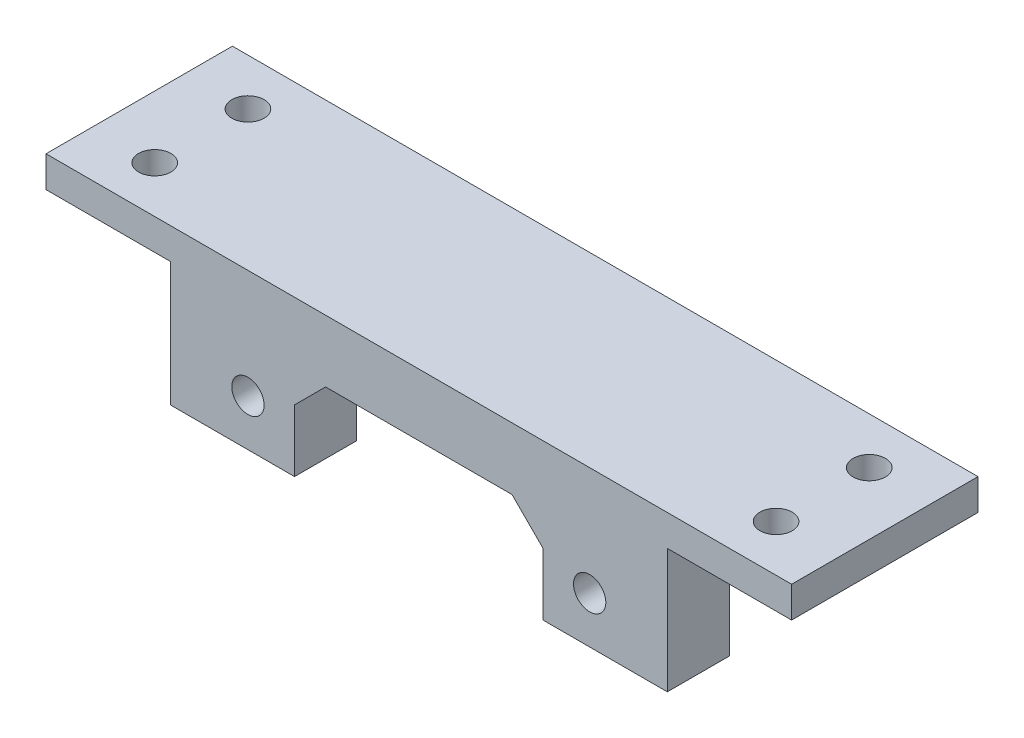
ISO-10303-21;
HEADER;
FILE_DESCRIPTION(('STEP AP214'),'2;1');
FILE_NAME('part.step','',(''),(''),'','','');
FILE_SCHEMA(('AUTOMOTIVE_DESIGN { 1 0 10303 214 1 1 1 1 }'));
ENDSEC;
DATA;
#1=APPLICATION_CONTEXT('core data for automotive mechanical design processes');
#2=APPLICATION_PROTOCOL_DEFINITION('international standard','automotive_design',2000,#1);
#3=PRODUCT_CONTEXT('',#1,'mechanical');
#4=PRODUCT('Part','Part','',(#3));
#5=PRODUCT_RELATED_PRODUCT_CATEGORY('part','',(#4));
#6=PRODUCT_DEFINITION_FORMATION('','',#4);
#7=PRODUCT_DEFINITION_CONTEXT('part definition',#1,'design');
#8=PRODUCT_DEFINITION('design','',#6,#7);
#9=PRODUCT_DEFINITION_SHAPE('','',#8);
#10=(LENGTH_UNIT() NAMED_UNIT(*) SI_UNIT(.MILLI.,.METRE.));
#11=(NAMED_UNIT(*) PLANE_ANGLE_UNIT() SI_UNIT($,.RADIAN.));
#12=(NAMED_UNIT(*) SI_UNIT($,.STERADIAN.) SOLID_ANGLE_UNIT());
#13=UNCERTAINTY_MEASURE_WITH_UNIT(LENGTH_MEASURE(1.E-05),#10,'distance_accuracy_value','');
#14=(GEOMETRIC_REPRESENTATION_CONTEXT(3) GLOBAL_UNCERTAINTY_ASSIGNED_CONTEXT((#13)) GLOBAL_UNIT_ASSIGNED_CONTEXT((#10,
#11,#12)) REPRESENTATION_CONTEXT('',''));
#15=CARTESIAN_POINT('',(0.,0.,0.));
#16=DIRECTION('',(0.,0.,1.));
#17=DIRECTION('',(1.,0.,0.));
#18=AXIS2_PLACEMENT_3D('',#15,#16,#17);
#19=CARTESIAN_POINT('',(0.,-20.,30.));
#20=DIRECTION('',(0.,1.,0.));
#21=DIRECTION('',(0.,0.,1.));
#22=AXIS2_PLACEMENT_3D('',#19,#20,#21);
#23=PLANE('',#22);
#24=DIRECTION('',(0.,0.,-1.));
#25=VECTOR('',#24,1.);
#26=CARTESIAN_POINT('',(40.,-20.,30.));
#27=LINE('',#26,#25);
#28=CARTESIAN_POINT('',(40.,-20.,10.));
#29=VERTEX_POINT('',#28);
#30=CARTESIAN_POINT('',(40.,-20.,0.));
#31=VERTEX_POINT('',#30);
#32=EDGE_CURVE('E413',#29,#31,#27,.T.);
#33=ORIENTED_EDGE('',*,*,#32,.F.);
#34=DIRECTION('',(-1.,0.,0.));
#35=VECTOR('',#34,1.);
#36=CARTESIAN_POINT('',(120.,-19.9999999999999,10.));
#37=LINE('',#36,#35);
#38=CARTESIAN_POINT('',(20.,-20.,10.));
#39=VERTEX_POINT('',#38);
#40=EDGE_CURVE('E300',#29,#39,#37,.T.);
#41=ORIENTED_EDGE('',*,*,#40,.T.);
#42=DIRECTION('',(0.,0.,-1.));
#43=VECTOR('',#42,1.);
#44=CARTESIAN_POINT('',(20.,-20.,30.));
#45=LINE('',#44,#43);
#46=CARTESIAN_POINT('',(20.,-20.,0.));
#47=VERTEX_POINT('',#46);
#48=EDGE_CURVE('E226',#39,#47,#45,.T.);
#49=ORIENTED_EDGE('',*,*,#48,.T.);
#50=DIRECTION('',(1.,0.,0.));
#51=VECTOR('',#50,1.);
#52=CARTESIAN_POINT('',(0.,-20.,0.));
#53=LINE('',#52,#51);
#54=EDGE_CURVE('E394',#47,#31,#53,.T.);
#55=ORIENTED_EDGE('',*,*,#54,.T.);
#56=EDGE_LOOP('',(#33,#41,#49,#55));
#57=FACE_BOUND('',#56,.T.);
#58=ADVANCED_FACE('F36',(#57),#23,.F.);
#59=CARTESIAN_POINT('',(40.,0.,30.));
#60=DIRECTION('',(-1.,0.,0.));
#61=DIRECTION('',(0.,0.,1.));
#62=AXIS2_PLACEMENT_3D('',#59,#60,#61);
#63=PLANE('',#62);
#64=DIRECTION('',(0.,0.,1.));
#65=VECTOR('',#64,1.);
#66=CARTESIAN_POINT('',(40.,-9.99999999999996,30.));
#67=LINE('',#66,#65);
#68=CARTESIAN_POINT('',(40.,-9.99999999999996,0.));
#69=VERTEX_POINT('',#68);
#70=CARTESIAN_POINT('',(40.,-9.99999999999996,9.99999999999999));
#71=VERTEX_POINT('',#70);
#72=EDGE_CURVE('E259',#69,#71,#67,.T.);
#73=ORIENTED_EDGE('',*,*,#72,.T.);
#74=DIRECTION('',(0.,-1.,0.));
#75=VECTOR('',#74,1.);
#76=CARTESIAN_POINT('',(40.,0.,9.99999999999999));
#77=LINE('',#76,#75);
#78=EDGE_CURVE('E319',#71,#29,#77,.T.);
#79=ORIENTED_EDGE('',*,*,#78,.T.);
#80=ORIENTED_EDGE('',*,*,#32,.T.);
#81=DIRECTION('',(0.,1.,0.));
#82=VECTOR('',#81,1.);
#83=CARTESIAN_POINT('',(40.,0.,0.));
#84=LINE('',#83,#82);
#85=EDGE_CURVE('E397',#31,#69,#84,.T.);
#86=ORIENTED_EDGE('',*,*,#85,.T.);
#87=EDGE_LOOP('',(#73,#79,#80,#86));
#88=FACE_BOUND('',#87,.T.);
#89=ADVANCED_FACE('F455',(#88),#63,.F.);
#90=CARTESIAN_POINT('',(80.,0.,30.));
#91=DIRECTION('',(1.,0.,0.));
#92=DIRECTION('',(0.,0.,-1.));
#93=AXIS2_PLACEMENT_3D('',#90,#91,#92);
#94=PLANE('',#93);
#95=DIRECTION('',(0.,0.,-1.));
#96=VECTOR('',#95,1.);
#97=CARTESIAN_POINT('',(80.,-20.,30.));
#98=LINE('',#97,#96);
#99=CARTESIAN_POINT('',(80.,-19.9999999999999,10.));
#100=VERTEX_POINT('',#99);
#101=CARTESIAN_POINT('',(80.,-20.,0.));
#102=VERTEX_POINT('',#101);
#103=EDGE_CURVE('E410',#100,#102,#98,.T.);
#104=ORIENTED_EDGE('',*,*,#103,.F.);
#105=DIRECTION('',(0.,1.,0.));
#106=VECTOR('',#105,1.);
#107=CARTESIAN_POINT('',(80.,0.,9.99999999999999));
#108=LINE('',#107,#106);
#109=CARTESIAN_POINT('',(80.,-10.,9.99999999999999));
#110=VERTEX_POINT('',#109);
#111=EDGE_CURVE('E325',#100,#110,#108,.T.);
#112=ORIENTED_EDGE('',*,*,#111,.T.);
#113=DIRECTION('',(0.,0.,-1.));
#114=VECTOR('',#113,1.);
#115=CARTESIAN_POINT('',(80.,-10.,0.));
#116=LINE('',#115,#114);
#117=CARTESIAN_POINT('',(80.,-10.,0.));
#118=VERTEX_POINT('',#117);
#119=EDGE_CURVE('E246',#110,#118,#116,.T.);
#120=ORIENTED_EDGE('',*,*,#119,.T.);
#121=DIRECTION('',(0.,-1.,0.));
#122=VECTOR('',#121,1.);
#123=CARTESIAN_POINT('',(80.,0.,0.));
#124=LINE('',#123,#122);
#125=EDGE_CURVE('E403',#118,#102,#124,.T.);
#126=ORIENTED_EDGE('',*,*,#125,.T.);
#127=EDGE_LOOP('',(#104,#112,#120,#126));
#128=FACE_BOUND('',#127,.T.);
#129=ADVANCED_FACE('F427',(#128),#94,.F.);
#130=CARTESIAN_POINT('',(0.,-20.,30.));
#131=DIRECTION('',(0.,1.,0.));
#132=DIRECTION('',(0.,0.,1.));
#133=AXIS2_PLACEMENT_3D('',#130,#131,#132);
#134=PLANE('',#133);
#135=DIRECTION('',(0.,0.,-1.));
#136=VECTOR('',#135,1.);
#137=CARTESIAN_POINT('',(100.,-20.,30.));
#138=LINE('',#137,#136);
#139=CARTESIAN_POINT('',(100.,-19.9999999999999,10.));
#140=VERTEX_POINT('',#139);
#141=CARTESIAN_POINT('',(100.,-20.,0.));
#142=VERTEX_POINT('',#141);
#143=EDGE_CURVE('E375',#140,#142,#138,.T.);
#144=ORIENTED_EDGE('',*,*,#143,.F.);
#145=EDGE_CURVE('E303',#140,#100,#37,.T.);
#146=ORIENTED_EDGE('',*,*,#145,.T.);
#147=ORIENTED_EDGE('',*,*,#103,.T.);
#148=DIRECTION('',(1.,0.,0.));
#149=VECTOR('',#148,1.);
#150=CARTESIAN_POINT('',(0.,-20.,0.));
#151=LINE('',#150,#149);
#152=EDGE_CURVE('E350',#102,#142,#151,.T.);
#153=ORIENTED_EDGE('',*,*,#152,.T.);
#154=EDGE_LOOP('',(#144,#146,#147,#153));
#155=FACE_BOUND('',#154,.T.);
#156=ADVANCED_FACE('F422',(#155),#134,.F.);
#157=CARTESIAN_POINT('',(80.,-10.,30.));
#158=DIRECTION('',(-0.707106781186552,-0.707106781186544,0.));
#159=DIRECTION('',(0.,0.,1.));
#160=AXIS2_PLACEMENT_3D('',#157,#158,#159);
#161=PLANE('',#160);
#162=ORIENTED_EDGE('',*,*,#119,.F.);
#163=DIRECTION('',(0.707106781186544,-0.707106781186552,0.));
#164=VECTOR('',#163,1.);
#165=CARTESIAN_POINT('',(80.,-10.,9.99999999999999));
#166=LINE('',#165,#164);
#167=CARTESIAN_POINT('',(75.,-4.99999999999995,10.));
#168=VERTEX_POINT('',#167);
#169=EDGE_CURVE('E322',#110,#168,#166,.F.);
#170=ORIENTED_EDGE('',*,*,#169,.T.);
#171=DIRECTION('',(0.,0.,1.));
#172=VECTOR('',#171,1.);
#173=CARTESIAN_POINT('',(75.,-5.,30.));
#174=LINE('',#173,#172);
#175=CARTESIAN_POINT('',(75.,-5.,0.));
#176=VERTEX_POINT('',#175);
#177=EDGE_CURVE('E255',#176,#168,#174,.T.);
#178=ORIENTED_EDGE('',*,*,#177,.F.);
#179=DIRECTION('',(0.707106781186544,-0.707106781186552,0.));
#180=VECTOR('',#179,1.);
#181=CARTESIAN_POINT('',(35.0000000000004,35.,0.));
#182=LINE('',#181,#180);
#183=EDGE_CURVE('E262',#118,#176,#182,.F.);
#184=ORIENTED_EDGE('',*,*,#183,.F.);
#185=EDGE_LOOP('',(#162,#170,#178,#184));
#186=FACE_BOUND('',#185,.T.);
#187=ADVANCED_FACE('F447',(#186),#161,.T.);
#188=CARTESIAN_POINT('',(45.0000000000001,-5.,30.));
#189=DIRECTION('',(0.707106781186543,-0.707106781186552,0.));
#190=DIRECTION('',(0.,0.,1.));
#191=AXIS2_PLACEMENT_3D('',#188,#189,#190);
#192=PLANE('',#191);
#193=DIRECTION('',(0.,0.,-1.));
#194=VECTOR('',#193,1.);
#195=CARTESIAN_POINT('',(45.0000000000001,-5.,0.));
#196=LINE('',#195,#194);
#197=CARTESIAN_POINT('',(45.0000000000001,-4.99999999999998,10.));
#198=VERTEX_POINT('',#197);
#199=CARTESIAN_POINT('',(45.0000000000001,-5.,0.));
#200=VERTEX_POINT('',#199);
#201=EDGE_CURVE('E250',#198,#200,#196,.T.);
#202=ORIENTED_EDGE('',*,*,#201,.F.);
#203=DIRECTION('',(0.707106781186552,0.707106781186543,0.));
#204=VECTOR('',#203,1.);
#205=CARTESIAN_POINT('',(45.0000000000001,-5.,9.99999999999999));
#206=LINE('',#205,#204);
#207=EDGE_CURVE('E11',#198,#71,#206,.F.);
#208=ORIENTED_EDGE('',*,*,#207,.T.);
#209=ORIENTED_EDGE('',*,*,#72,.F.);
#210=DIRECTION('',(0.707106781186552,0.707106781186543,0.));
#211=VECTOR('',#210,1.);
#212=CARTESIAN_POINT('',(24.9999999999997,-25.0000000000001,0.));
#213=LINE('',#212,#211);
#214=EDGE_CURVE('E266',#200,#69,#213,.F.);
#215=ORIENTED_EDGE('',*,*,#214,.F.);
#216=EDGE_LOOP('',(#202,#208,#209,#215));
#217=FACE_BOUND('',#216,.T.);
#218=ADVANCED_FACE('F457',(#217),#192,.T.);
#219=CARTESIAN_POINT('',(100.,0.,30.));
#220=DIRECTION('',(-1.,0.,0.));
#221=DIRECTION('',(0.,0.,1.));
#222=AXIS2_PLACEMENT_3D('',#219,#220,#221);
#223=PLANE('',#222);
#224=DIRECTION('',(0.,0.,-1.));
#225=VECTOR('',#224,1.);
#226=CARTESIAN_POINT('',(100.,-4.99999999999993,30.));
#227=LINE('',#226,#225);
#228=CARTESIAN_POINT('',(100.,-4.99999999999993,20.));
#229=VERTEX_POINT('',#228);
#230=CARTESIAN_POINT('',(100.,-4.99999999999993,10.));
#231=VERTEX_POINT('',#230);
#232=EDGE_CURVE('E316',#229,#231,#227,.T.);
#233=ORIENTED_EDGE('',*,*,#232,.T.);
#234=DIRECTION('',(0.,-1.,0.));
#235=VECTOR('',#234,1.);
#236=CARTESIAN_POINT('',(100.,0.,9.99999999999999));
#237=LINE('',#236,#235);
#238=EDGE_CURVE('E328',#231,#140,#237,.T.);
#239=ORIENTED_EDGE('',*,*,#238,.T.);
#240=ORIENTED_EDGE('',*,*,#143,.T.);
#241=DIRECTION('',(0.,1.,0.));
#242=VECTOR('',#241,1.);
#243=CARTESIAN_POINT('',(100.,0.,0.));
#244=LINE('',#243,#242);
#245=CARTESIAN_POINT('',(100.,0.,0.));
#246=VERTEX_POINT('',#245);
#247=EDGE_CURVE('E273',#142,#246,#244,.T.);
#248=ORIENTED_EDGE('',*,*,#247,.T.);
#249=DIRECTION('',(0.,0.,-1.));
#250=VECTOR('',#249,1.);
#251=CARTESIAN_POINT('',(100.,0.,30.));
#252=LINE('',#251,#250);
#253=CARTESIAN_POINT('',(100.,0.,30.));
#254=VERTEX_POINT('',#253);
#255=EDGE_CURVE('E243',#254,#246,#252,.T.);
#256=ORIENTED_EDGE('',*,*,#255,.F.);
#257=DIRECTION('',(0.,1.,0.));
#258=VECTOR('',#257,1.);
#259=CARTESIAN_POINT('',(100.,0.,30.));
#260=LINE('',#259,#258);
#261=CARTESIAN_POINT('',(100.,-20.,30.));
#262=VERTEX_POINT('',#261);
#263=EDGE_CURVE('E346',#262,#254,#260,.T.);
#264=ORIENTED_EDGE('',*,*,#263,.F.);
#265=CARTESIAN_POINT('',(100.,-19.9999999999999,20.));
#266=VERTEX_POINT('',#265);
#267=EDGE_CURVE('E408',#262,#266,#138,.T.);
#268=ORIENTED_EDGE('',*,*,#267,.T.);
#269=DIRECTION('',(0.,1.,0.));
#270=VECTOR('',#269,1.);
#271=CARTESIAN_POINT('',(100.,0.,20.));
#272=LINE('',#271,#270);
#273=EDGE_CURVE('E313',#266,#229,#272,.T.);
#274=ORIENTED_EDGE('',*,*,#273,.T.);
#275=EDGE_LOOP('',(#233,#239,#240,#248,#256,#264,#268,#274));
#276=FACE_BOUND('',#275,.T.);
#277=ADVANCED_FACE('F435',(#276),#223,.F.);
#278=CARTESIAN_POINT('',(0.,0.,30.));
#279=DIRECTION('',(0.,1.,0.));
#280=DIRECTION('',(0.,0.,1.));
#281=AXIS2_PLACEMENT_3D('',#278,#279,#280);
#282=PLANE('',#281);
#283=CARTESIAN_POINT('',(110.,0.,7.5));
#284=DIRECTION('',(0.,1.,0.));
#285=DIRECTION('',(0.,0.,1.));
#286=AXIS2_PLACEMENT_3D('',#283,#284,#285);
#287=CIRCLE('',#286,2.6);
#288=CARTESIAN_POINT('',(110.,0.,10.1));
#289=VERTEX_POINT('',#288);
#290=EDGE_CURVE('E341',#289,#289,#287,.T.);
#291=ORIENTED_EDGE('',*,*,#290,.T.);
#292=EDGE_LOOP('',(#291));
#293=FACE_BOUND('',#292,.T.);
#294=CARTESIAN_POINT('',(110.,0.,22.5));
#295=DIRECTION('',(0.,1.,0.));
#296=DIRECTION('',(0.,0.,1.));
#297=AXIS2_PLACEMENT_3D('',#294,#295,#296);
#298=CIRCLE('',#297,2.6);
#299=CARTESIAN_POINT('',(110.,0.,25.1));
#300=VERTEX_POINT('',#299);
#301=EDGE_CURVE('E278',#300,#300,#298,.T.);
#302=ORIENTED_EDGE('',*,*,#301,.T.);
#303=EDGE_LOOP('',(#302));
#304=FACE_BOUND('',#303,.T.);
#305=DIRECTION('',(1.,0.,0.));
#306=VECTOR('',#305,1.);
#307=CARTESIAN_POINT('',(0.,0.,0.));
#308=LINE('',#307,#306);
#309=CARTESIAN_POINT('',(120.,0.,0.));
#310=VERTEX_POINT('',#309);
#311=EDGE_CURVE('E378',#246,#310,#308,.T.);
#312=ORIENTED_EDGE('',*,*,#311,.T.);
#313=DIRECTION('',(0.,0.,-1.));
#314=VECTOR('',#313,1.);
#315=CARTESIAN_POINT('',(120.,0.,30.));
#316=LINE('',#315,#314);
#317=CARTESIAN_POINT('',(120.,0.,30.));
#318=VERTEX_POINT('',#317);
#319=EDGE_CURVE('E240',#318,#310,#316,.T.);
#320=ORIENTED_EDGE('',*,*,#319,.F.);
#321=DIRECTION('',(1.,0.,0.));
#322=VECTOR('',#321,1.);
#323=CARTESIAN_POINT('',(0.,0.,30.));
#324=LINE('',#323,#322);
#325=EDGE_CURVE('E349',#254,#318,#324,.T.);
#326=ORIENTED_EDGE('',*,*,#325,.F.);
#327=ORIENTED_EDGE('',*,*,#255,.T.);
#328=EDGE_LOOP('',(#312,#320,#326,#327));
#329=FACE_BOUND('',#328,.T.);
#330=ADVANCED_FACE('F482',(#293,#304,#329),#282,.F.);
#331=CARTESIAN_POINT('',(120.,0.,30.));
#332=DIRECTION('',(-1.,0.,0.));
#333=DIRECTION('',(0.,0.,1.));
#334=AXIS2_PLACEMENT_3D('',#331,#332,#333);
#335=PLANE('',#334);
#336=DIRECTION('',(0.,1.,0.));
#337=VECTOR('',#336,1.);
#338=CARTESIAN_POINT('',(120.,0.,0.));
#339=LINE('',#338,#337);
#340=CARTESIAN_POINT('',(120.,5.,0.));
#341=VERTEX_POINT('',#340);
#342=EDGE_CURVE('E380',#310,#341,#339,.T.);
#343=ORIENTED_EDGE('',*,*,#342,.T.);
#344=DIRECTION('',(0.,0.,-1.));
#345=VECTOR('',#344,1.);
#346=CARTESIAN_POINT('',(120.,5.,30.));
#347=LINE('',#346,#345);
#348=CARTESIAN_POINT('',(120.,5.,30.));
#349=VERTEX_POINT('',#348);
#350=EDGE_CURVE('E238',#349,#341,#347,.T.);
#351=ORIENTED_EDGE('',*,*,#350,.F.);
#352=DIRECTION('',(0.,1.,0.));
#353=VECTOR('',#352,1.);
#354=CARTESIAN_POINT('',(120.,0.,30.));
#355=LINE('',#354,#353);
#356=EDGE_CURVE('E352',#318,#349,#355,.T.);
#357=ORIENTED_EDGE('',*,*,#356,.F.);
#358=ORIENTED_EDGE('',*,*,#319,.T.);
#359=EDGE_LOOP('',(#343,#351,#357,#358));
#360=FACE_BOUND('',#359,.T.);
#361=ADVANCED_FACE('F479',(#360),#335,.F.);
#362=CARTESIAN_POINT('',(0.,5.,30.));
#363=DIRECTION('',(0.,1.,0.));
#364=DIRECTION('',(0.,0.,1.));
#365=AXIS2_PLACEMENT_3D('',#362,#363,#364);
#366=PLANE('',#365);
#367=CARTESIAN_POINT('',(10.,5.,22.5));
#368=DIRECTION('',(0.,1.,0.));
#369=DIRECTION('',(0.,0.,1.));
#370=AXIS2_PLACEMENT_3D('',#367,#368,#369);
#371=CIRCLE('',#370,2.6);
#372=CARTESIAN_POINT('',(10.,5.,25.1));
#373=VERTEX_POINT('',#372);
#374=EDGE_CURVE('E279',#373,#373,#371,.T.);
#375=ORIENTED_EDGE('',*,*,#374,.F.);
#376=EDGE_LOOP('',(#375));
#377=FACE_BOUND('',#376,.T.);
#378=CARTESIAN_POINT('',(110.,5.,7.5));
#379=DIRECTION('',(0.,1.,0.));
#380=DIRECTION('',(0.,0.,1.));
#381=AXIS2_PLACEMENT_3D('',#378,#379,#380);
#382=CIRCLE('',#381,2.6);
#383=CARTESIAN_POINT('',(110.,5.,10.1));
#384=VERTEX_POINT('',#383);
#385=EDGE_CURVE('E334',#384,#384,#382,.T.);
#386=ORIENTED_EDGE('',*,*,#385,.F.);
#387=EDGE_LOOP('',(#386));
#388=FACE_BOUND('',#387,.T.);
#389=CARTESIAN_POINT('',(110.,5.,22.5));
#390=DIRECTION('',(0.,1.,0.));
#391=DIRECTION('',(0.,0.,1.));
#392=AXIS2_PLACEMENT_3D('',#389,#390,#391);
#393=CIRCLE('',#392,2.6);
#394=CARTESIAN_POINT('',(110.,5.,25.1));
#395=VERTEX_POINT('',#394);
#396=EDGE_CURVE('E331',#395,#395,#393,.T.);
#397=ORIENTED_EDGE('',*,*,#396,.F.);
#398=EDGE_LOOP('',(#397));
#399=FACE_BOUND('',#398,.T.);
#400=CARTESIAN_POINT('',(10.,5.,7.5));
#401=DIRECTION('',(0.,1.,0.));
#402=DIRECTION('',(0.,0.,1.));
#403=AXIS2_PLACEMENT_3D('',#400,#401,#402);
#404=CIRCLE('',#403,2.6);
#405=CARTESIAN_POINT('',(10.,5.,10.1));
#406=VERTEX_POINT('',#405);
#407=EDGE_CURVE('E274',#406,#406,#404,.T.);
#408=ORIENTED_EDGE('',*,*,#407,.F.);
#409=EDGE_LOOP('',(#408));
#410=FACE_BOUND('',#409,.T.);
#411=DIRECTION('',(1.,0.,0.));
#412=VECTOR('',#411,1.);
#413=CARTESIAN_POINT('',(0.,5.,0.));
#414=LINE('',#413,#412);
#415=CARTESIAN_POINT('',(0.,5.,0.));
#416=VERTEX_POINT('',#415);
#417=EDGE_CURVE('E383',#416,#341,#414,.T.);
#418=ORIENTED_EDGE('',*,*,#417,.F.);
#419=DIRECTION('',(0.,0.,-1.));
#420=VECTOR('',#419,1.);
#421=CARTESIAN_POINT('',(0.,5.,30.));
#422=LINE('',#421,#420);
#423=CARTESIAN_POINT('',(0.,5.,30.));
#424=VERTEX_POINT('',#423);
#425=EDGE_CURVE('E236',#424,#416,#422,.T.);
#426=ORIENTED_EDGE('',*,*,#425,.F.);
#427=DIRECTION('',(1.,0.,0.));
#428=VECTOR('',#427,1.);
#429=CARTESIAN_POINT('',(0.,5.,30.));
#430=LINE('',#429,#428);
#431=EDGE_CURVE('E354',#424,#349,#430,.T.);
#432=ORIENTED_EDGE('',*,*,#431,.T.);
#433=ORIENTED_EDGE('',*,*,#350,.T.);
#434=EDGE_LOOP('',(#418,#426,#432,#433));
#435=FACE_BOUND('',#434,.T.);
#436=ADVANCED_FACE('F474',(#377,#388,#399,#410,#435),#366,.T.);
#437=CARTESIAN_POINT('',(0.,0.,30.));
#438=DIRECTION('',(-1.,0.,0.));
#439=DIRECTION('',(0.,0.,1.));
#440=AXIS2_PLACEMENT_3D('',#437,#438,#439);
#441=PLANE('',#440);
#442=DIRECTION('',(0.,1.,0.));
#443=VECTOR('',#442,1.);
#444=CARTESIAN_POINT('',(0.,0.,0.));
#445=LINE('',#444,#443);
#446=CARTESIAN_POINT('',(0.,0.,0.));
#447=VERTEX_POINT('',#446);
#448=EDGE_CURVE('E386',#447,#416,#445,.T.);
#449=ORIENTED_EDGE('',*,*,#448,.F.);
#450=DIRECTION('',(0.,0.,-1.));
#451=VECTOR('',#450,1.);
#452=CARTESIAN_POINT('',(0.,0.,30.));
#453=LINE('',#452,#451);
#454=CARTESIAN_POINT('',(0.,0.,30.));
#455=VERTEX_POINT('',#454);
#456=EDGE_CURVE('E229',#455,#447,#453,.T.);
#457=ORIENTED_EDGE('',*,*,#456,.F.);
#458=DIRECTION('',(0.,1.,0.));
#459=VECTOR('',#458,1.);
#460=CARTESIAN_POINT('',(0.,0.,30.));
#461=LINE('',#460,#459);
#462=EDGE_CURVE('E357',#455,#424,#461,.T.);
#463=ORIENTED_EDGE('',*,*,#462,.T.);
#464=ORIENTED_EDGE('',*,*,#425,.T.);
#465=EDGE_LOOP('',(#449,#457,#463,#464));
#466=FACE_BOUND('',#465,.T.);
#467=ADVANCED_FACE('F471',(#466),#441,.T.);
#468=CARTESIAN_POINT('',(0.,0.,30.));
#469=DIRECTION('',(0.,1.,0.));
#470=DIRECTION('',(0.,0.,1.));
#471=AXIS2_PLACEMENT_3D('',#468,#469,#470);
#472=PLANE('',#471);
#473=CARTESIAN_POINT('',(10.,0.,22.5));
#474=DIRECTION('',(0.,1.,0.));
#475=DIRECTION('',(0.,0.,1.));
#476=AXIS2_PLACEMENT_3D('',#473,#474,#475);
#477=CIRCLE('',#476,2.6);
#478=CARTESIAN_POINT('',(10.,0.,25.1));
#479=VERTEX_POINT('',#478);
#480=EDGE_CURVE('E275',#479,#479,#477,.T.);
#481=ORIENTED_EDGE('',*,*,#480,.T.);
#482=EDGE_LOOP('',(#481));
#483=FACE_BOUND('',#482,.T.);
#484=CARTESIAN_POINT('',(10.,0.,7.5));
#485=DIRECTION('',(0.,1.,0.));
#486=DIRECTION('',(0.,0.,1.));
#487=AXIS2_PLACEMENT_3D('',#484,#485,#486);
#488=CIRCLE('',#487,2.6);
#489=CARTESIAN_POINT('',(10.,0.,10.1));
#490=VERTEX_POINT('',#489);
#491=EDGE_CURVE('E270',#490,#490,#488,.T.);
#492=ORIENTED_EDGE('',*,*,#491,.T.);
#493=EDGE_LOOP('',(#492));
#494=FACE_BOUND('',#493,.T.);
#495=DIRECTION('',(1.,0.,0.));
#496=VECTOR('',#495,1.);
#497=CARTESIAN_POINT('',(0.,0.,0.));
#498=LINE('',#497,#496);
#499=CARTESIAN_POINT('',(20.,0.,0.));
#500=VERTEX_POINT('',#499);
#501=EDGE_CURVE('E389',#447,#500,#498,.T.);
#502=ORIENTED_EDGE('',*,*,#501,.T.);
#503=DIRECTION('',(0.,0.,-1.));
#504=VECTOR('',#503,1.);
#505=CARTESIAN_POINT('',(20.,0.,30.));
#506=LINE('',#505,#504);
#507=CARTESIAN_POINT('',(20.,0.,30.));
#508=VERTEX_POINT('',#507);
#509=EDGE_CURVE('E225',#508,#500,#506,.T.);
#510=ORIENTED_EDGE('',*,*,#509,.F.);
#511=DIRECTION('',(1.,0.,0.));
#512=VECTOR('',#511,1.);
#513=CARTESIAN_POINT('',(0.,0.,30.));
#514=LINE('',#513,#512);
#515=EDGE_CURVE('E360',#455,#508,#514,.T.);
#516=ORIENTED_EDGE('',*,*,#515,.F.);
#517=ORIENTED_EDGE('',*,*,#456,.T.);
#518=EDGE_LOOP('',(#502,#510,#516,#517));
#519=FACE_BOUND('',#518,.T.);
#520=ADVANCED_FACE('F468',(#483,#494,#519),#472,.F.);
#521=CARTESIAN_POINT('',(20.,0.,30.));
#522=DIRECTION('',(1.,0.,0.));
#523=DIRECTION('',(0.,1.,0.));
#524=AXIS2_PLACEMENT_3D('',#521,#522,#523);
#525=PLANE('',#524);
#526=ORIENTED_EDGE('',*,*,#48,.F.);
#527=DIRECTION('',(0.,-1.,0.));
#528=VECTOR('',#527,1.);
#529=CARTESIAN_POINT('',(20.,-20.,10.));
#530=LINE('',#529,#528);
#531=CARTESIAN_POINT('',(20.,-5.,10.));
#532=VERTEX_POINT('',#531);
#533=EDGE_CURVE('E209',#532,#39,#530,.T.);
#534=ORIENTED_EDGE('',*,*,#533,.F.);
#535=DIRECTION('',(0.,0.,-1.));
#536=VECTOR('',#535,1.);
#537=CARTESIAN_POINT('',(20.,-5.,10.));
#538=LINE('',#537,#536);
#539=CARTESIAN_POINT('',(20.,-5.,20.));
#540=VERTEX_POINT('',#539);
#541=EDGE_CURVE('E220',#540,#532,#538,.T.);
#542=ORIENTED_EDGE('',*,*,#541,.F.);
#543=DIRECTION('',(0.,1.,0.));
#544=VECTOR('',#543,1.);
#545=CARTESIAN_POINT('',(20.,-5.,20.));
#546=LINE('',#545,#544);
#547=CARTESIAN_POINT('',(20.,-20.,20.));
#548=VERTEX_POINT('',#547);
#549=EDGE_CURVE('E200',#548,#540,#546,.T.);
#550=ORIENTED_EDGE('',*,*,#549,.F.);
#551=CARTESIAN_POINT('',(20.,-20.,30.));
#552=VERTEX_POINT('',#551);
#553=EDGE_CURVE('E216',#552,#548,#45,.T.);
#554=ORIENTED_EDGE('',*,*,#553,.F.);
#555=DIRECTION('',(0.,-1.,0.));
#556=VECTOR('',#555,1.);
#557=CARTESIAN_POINT('',(20.,0.,30.));
#558=LINE('',#557,#556);
#559=EDGE_CURVE('E362',#508,#552,#558,.T.);
#560=ORIENTED_EDGE('',*,*,#559,.F.);
#561=ORIENTED_EDGE('',*,*,#509,.T.);
#562=DIRECTION('',(0.,-1.,0.));
#563=VECTOR('',#562,1.);
#564=CARTESIAN_POINT('',(20.,0.,0.));
#565=LINE('',#564,#563);
#566=EDGE_CURVE('E391',#500,#47,#565,.T.);
#567=ORIENTED_EDGE('',*,*,#566,.T.);
#568=EDGE_LOOP('',(#526,#534,#542,#550,#554,#560,#561,#567));
#569=FACE_BOUND('',#568,.T.);
#570=ADVANCED_FACE('F214',(#569),#525,.F.);
#571=ORIENTED_EDGE('',*,*,#553,.T.);
#572=DIRECTION('',(-1.,0.,0.));
#573=VECTOR('',#572,1.);
#574=CARTESIAN_POINT('',(120.,-19.9999999999999,20.));
#575=LINE('',#574,#573);
#576=CARTESIAN_POINT('',(40.,-20.,20.));
#577=VERTEX_POINT('',#576);
#578=EDGE_CURVE('E197',#577,#548,#575,.T.);
#579=ORIENTED_EDGE('',*,*,#578,.F.);
#580=CARTESIAN_POINT('',(40.,-20.,30.));
#581=VERTEX_POINT('',#580);
#582=EDGE_CURVE('E231',#581,#577,#27,.T.);
#583=ORIENTED_EDGE('',*,*,#582,.F.);
#584=DIRECTION('',(1.,0.,0.));
#585=VECTOR('',#584,1.);
#586=CARTESIAN_POINT('',(0.,-20.,30.));
#587=LINE('',#586,#585);
#588=EDGE_CURVE('E224',#552,#581,#587,.T.);
#589=ORIENTED_EDGE('',*,*,#588,.F.);
#590=EDGE_LOOP('',(#571,#579,#583,#589));
#591=FACE_BOUND('',#590,.T.);
#592=ADVANCED_FACE('F223',(#591),#23,.F.);
#593=ORIENTED_EDGE('',*,*,#582,.T.);
#594=DIRECTION('',(0.,1.,0.));
#595=VECTOR('',#594,1.);
#596=CARTESIAN_POINT('',(40.,0.,20.));
#597=LINE('',#596,#595);
#598=CARTESIAN_POINT('',(40.,-9.99999999999996,20.));
#599=VERTEX_POINT('',#598);
#600=EDGE_CURVE('E203',#577,#599,#597,.T.);
#601=ORIENTED_EDGE('',*,*,#600,.T.);
#602=CARTESIAN_POINT('',(40.,-9.99999999999996,30.));
#603=VERTEX_POINT('',#602);
#604=EDGE_CURVE('E258',#599,#603,#67,.T.);
#605=ORIENTED_EDGE('',*,*,#604,.T.);
#606=DIRECTION('',(0.,1.,0.));
#607=VECTOR('',#606,1.);
#608=CARTESIAN_POINT('',(40.,0.,30.));
#609=LINE('',#608,#607);
#610=EDGE_CURVE('E365',#581,#603,#609,.T.);
#611=ORIENTED_EDGE('',*,*,#610,.F.);
#612=EDGE_LOOP('',(#593,#601,#605,#611));
#613=FACE_BOUND('',#612,.T.);
#614=ADVANCED_FACE('F503',(#613),#63,.F.);
#615=CARTESIAN_POINT('',(0.,-5.,30.));
#616=DIRECTION('',(0.,1.,0.));
#617=DIRECTION('',(0.,0.,1.));
#618=AXIS2_PLACEMENT_3D('',#615,#616,#617);
#619=PLANE('',#618);
#620=CARTESIAN_POINT('',(45.0000000000001,-5.,30.));
#621=VERTEX_POINT('',#620);
#622=CARTESIAN_POINT('',(45.0000000000001,-5.,20.));
#623=VERTEX_POINT('',#622);
#624=EDGE_CURVE('E251',#621,#623,#196,.T.);
#625=ORIENTED_EDGE('',*,*,#624,.T.);
#626=DIRECTION('',(-1.,0.,0.));
#627=VECTOR('',#626,1.);
#628=CARTESIAN_POINT('',(120.,-4.99999999999991,20.));
#629=LINE('',#628,#627);
#630=EDGE_CURVE('E61',#623,#540,#629,.T.);
#631=ORIENTED_EDGE('',*,*,#630,.T.);
#632=ORIENTED_EDGE('',*,*,#541,.T.);
#633=DIRECTION('',(-1.,0.,0.));
#634=VECTOR('',#633,1.);
#635=CARTESIAN_POINT('',(120.,-4.99999999999991,10.));
#636=LINE('',#635,#634);
#637=EDGE_CURVE('E305',#198,#532,#636,.T.);
#638=ORIENTED_EDGE('',*,*,#637,.F.);
#639=ORIENTED_EDGE('',*,*,#201,.T.);
#640=DIRECTION('',(1.,0.,0.));
#641=VECTOR('',#640,1.);
#642=CARTESIAN_POINT('',(0.,-5.,0.));
#643=LINE('',#642,#641);
#644=EDGE_CURVE('E400',#200,#176,#643,.T.);
#645=ORIENTED_EDGE('',*,*,#644,.T.);
#646=ORIENTED_EDGE('',*,*,#177,.T.);
#647=EDGE_CURVE('E304',#231,#168,#636,.T.);
#648=ORIENTED_EDGE('',*,*,#647,.F.);
#649=ORIENTED_EDGE('',*,*,#232,.F.);
#650=CARTESIAN_POINT('',(75.,-4.99999999999996,20.));
#651=VERTEX_POINT('',#650);
#652=EDGE_CURVE('E307',#229,#651,#629,.T.);
#653=ORIENTED_EDGE('',*,*,#652,.T.);
#654=CARTESIAN_POINT('',(75.,-5.,30.));
#655=VERTEX_POINT('',#654);
#656=EDGE_CURVE('E254',#651,#655,#174,.T.);
#657=ORIENTED_EDGE('',*,*,#656,.T.);
#658=DIRECTION('',(1.,0.,0.));
#659=VECTOR('',#658,1.);
#660=CARTESIAN_POINT('',(0.,-5.,30.));
#661=LINE('',#660,#659);
#662=EDGE_CURVE('E368',#621,#655,#661,.T.);
#663=ORIENTED_EDGE('',*,*,#662,.F.);
#664=EDGE_LOOP('',(#625,#631,#632,#638,#639,#645,#646,#648,#649,#653,#657,#663));
#665=FACE_BOUND('',#664,.T.);
#666=ADVANCED_FACE('F441',(#665),#619,.F.);
#667=CARTESIAN_POINT('',(80.,-10.,30.));
#668=VERTEX_POINT('',#667);
#669=CARTESIAN_POINT('',(80.,-10.,20.));
#670=VERTEX_POINT('',#669);
#671=EDGE_CURVE('E247',#668,#670,#116,.T.);
#672=ORIENTED_EDGE('',*,*,#671,.T.);
#673=DIRECTION('',(0.,-1.,0.));
#674=VECTOR('',#673,1.);
#675=CARTESIAN_POINT('',(80.,0.,20.));
#676=LINE('',#675,#674);
#677=CARTESIAN_POINT('',(80.,-19.9999999999999,20.));
#678=VERTEX_POINT('',#677);
#679=EDGE_CURVE('E53',#670,#678,#676,.T.);
#680=ORIENTED_EDGE('',*,*,#679,.T.);
#681=CARTESIAN_POINT('',(80.,-20.,30.));
#682=VERTEX_POINT('',#681);
#683=EDGE_CURVE('E411',#682,#678,#98,.T.);
#684=ORIENTED_EDGE('',*,*,#683,.F.);
#685=DIRECTION('',(0.,-1.,0.));
#686=VECTOR('',#685,1.);
#687=CARTESIAN_POINT('',(80.,0.,30.));
#688=LINE('',#687,#686);
#689=EDGE_CURVE('E371',#668,#682,#688,.T.);
#690=ORIENTED_EDGE('',*,*,#689,.F.);
#691=EDGE_LOOP('',(#672,#680,#684,#690));
#692=FACE_BOUND('',#691,.T.);
#693=ADVANCED_FACE('F489',(#692),#94,.F.);
#694=ORIENTED_EDGE('',*,*,#683,.T.);
#695=EDGE_CURVE('E208',#266,#678,#575,.T.);
#696=ORIENTED_EDGE('',*,*,#695,.F.);
#697=ORIENTED_EDGE('',*,*,#267,.F.);
#698=DIRECTION('',(1.,0.,0.));
#699=VECTOR('',#698,1.);
#700=CARTESIAN_POINT('',(0.,-20.,30.));
#701=LINE('',#700,#699);
#702=EDGE_CURVE('E373',#682,#262,#701,.T.);
#703=ORIENTED_EDGE('',*,*,#702,.F.);
#704=EDGE_LOOP('',(#694,#696,#697,#703));
#705=FACE_BOUND('',#704,.T.);
#706=ADVANCED_FACE('F486',(#705),#134,.F.);
#707=CARTESIAN_POINT('',(0.,0.,30.));
#708=DIRECTION('',(0.,0.,1.));
#709=DIRECTION('',(1.,0.,0.));
#710=AXIS2_PLACEMENT_3D('',#707,#708,#709);
#711=PLANE('',#710);
#712=CARTESIAN_POINT('',(32.5,-12.5,30.));
#713=DIRECTION('',(0.,0.,-1.));
#714=DIRECTION('',(-1.,0.,0.));
#715=AXIS2_PLACEMENT_3D('',#712,#713,#714);
#716=CIRCLE('',#715,2.6);
#717=CARTESIAN_POINT('',(29.9,-12.5,30.));
#718=VERTEX_POINT('',#717);
#719=EDGE_CURVE('E787',#718,#718,#716,.T.);
#720=ORIENTED_EDGE('',*,*,#719,.T.);
#721=EDGE_LOOP('',(#720));
#722=FACE_BOUND('',#721,.T.);
#723=CARTESIAN_POINT('',(87.5,-12.5,30.));
#724=DIRECTION('',(0.,0.,-1.));
#725=DIRECTION('',(-1.,0.,0.));
#726=AXIS2_PLACEMENT_3D('',#723,#724,#725);
#727=CIRCLE('',#726,2.6);
#728=CARTESIAN_POINT('',(84.9,-12.5,30.));
#729=VERTEX_POINT('',#728);
#730=EDGE_CURVE('E282',#729,#729,#727,.T.);
#731=ORIENTED_EDGE('',*,*,#730,.T.);
#732=EDGE_LOOP('',(#731));
#733=FACE_BOUND('',#732,.T.);
#734=ORIENTED_EDGE('',*,*,#263,.T.);
#735=ORIENTED_EDGE('',*,*,#325,.T.);
#736=ORIENTED_EDGE('',*,*,#356,.T.);
#737=ORIENTED_EDGE('',*,*,#431,.F.);
#738=ORIENTED_EDGE('',*,*,#462,.F.);
#739=ORIENTED_EDGE('',*,*,#515,.T.);
#740=ORIENTED_EDGE('',*,*,#559,.T.);
#741=ORIENTED_EDGE('',*,*,#588,.T.);
#742=ORIENTED_EDGE('',*,*,#610,.T.);
#743=DIRECTION('',(-0.707106781186552,-0.707106781186543,0.));
#744=VECTOR('',#743,1.);
#745=CARTESIAN_POINT('',(45.0000000000001,-5.,30.));
#746=LINE('',#745,#744);
#747=EDGE_CURVE('E268',#603,#621,#746,.F.);
#748=ORIENTED_EDGE('',*,*,#747,.T.);
#749=ORIENTED_EDGE('',*,*,#662,.T.);
#750=DIRECTION('',(-0.707106781186544,0.707106781186552,0.));
#751=VECTOR('',#750,1.);
#752=CARTESIAN_POINT('',(80.,-10.,30.));
#753=LINE('',#752,#751);
#754=EDGE_CURVE('E264',#655,#668,#753,.F.);
#755=ORIENTED_EDGE('',*,*,#754,.T.);
#756=ORIENTED_EDGE('',*,*,#689,.T.);
#757=ORIENTED_EDGE('',*,*,#702,.T.);
#758=EDGE_LOOP('',(#734,#735,#736,#737,#738,#739,#740,#741,#742,#748,#749,#755,#756,#757));
#759=FACE_BOUND('',#758,.T.);
#760=ADVANCED_FACE('F484',(#722,#733,#759),#711,.T.);
#761=CARTESIAN_POINT('',(0.,0.,0.));
#762=DIRECTION('',(0.,0.,1.));
#763=DIRECTION('',(1.,0.,0.));
#764=AXIS2_PLACEMENT_3D('',#761,#762,#763);
#765=PLANE('',#764);
#766=CARTESIAN_POINT('',(32.5,-12.5,0.));
#767=DIRECTION('',(0.,0.,-1.));
#768=DIRECTION('',(-1.,0.,0.));
#769=AXIS2_PLACEMENT_3D('',#766,#767,#768);
#770=CIRCLE('',#769,2.6);
#771=CARTESIAN_POINT('',(29.9,-12.5,0.));
#772=VERTEX_POINT('',#771);
#773=EDGE_CURVE('E792',#772,#772,#770,.T.);
#774=ORIENTED_EDGE('',*,*,#773,.F.);
#775=EDGE_LOOP('',(#774));
#776=FACE_BOUND('',#775,.T.);
#777=CARTESIAN_POINT('',(87.5,-12.5,0.));
#778=DIRECTION('',(0.,0.,-1.));
#779=DIRECTION('',(-1.,0.,0.));
#780=AXIS2_PLACEMENT_3D('',#777,#778,#779);
#781=CIRCLE('',#780,2.6);
#782=CARTESIAN_POINT('',(84.9,-12.5,0.));
#783=VERTEX_POINT('',#782);
#784=EDGE_CURVE('E288',#783,#783,#781,.T.);
#785=ORIENTED_EDGE('',*,*,#784,.F.);
#786=EDGE_LOOP('',(#785));
#787=FACE_BOUND('',#786,.T.);
#788=ORIENTED_EDGE('',*,*,#247,.F.);
#789=ORIENTED_EDGE('',*,*,#152,.F.);
#790=ORIENTED_EDGE('',*,*,#125,.F.);
#791=ORIENTED_EDGE('',*,*,#183,.T.);
#792=ORIENTED_EDGE('',*,*,#644,.F.);
#793=ORIENTED_EDGE('',*,*,#214,.T.);
#794=ORIENTED_EDGE('',*,*,#85,.F.);
#795=ORIENTED_EDGE('',*,*,#54,.F.);
#796=ORIENTED_EDGE('',*,*,#566,.F.);
#797=ORIENTED_EDGE('',*,*,#501,.F.);
#798=ORIENTED_EDGE('',*,*,#448,.T.);
#799=ORIENTED_EDGE('',*,*,#417,.T.);
#800=ORIENTED_EDGE('',*,*,#342,.F.);
#801=ORIENTED_EDGE('',*,*,#311,.F.);
#802=EDGE_LOOP('',(#788,#789,#790,#791,#792,#793,#794,#795,#796,#797,#798,#799,#800,#801));
#803=FACE_BOUND('',#802,.T.);
#804=ADVANCED_FACE('F431',(#776,#787,#803),#765,.F.);
#805=ORIENTED_EDGE('',*,*,#656,.F.);
#806=DIRECTION('',(-0.707106781186544,0.707106781186552,0.));
#807=VECTOR('',#806,1.);
#808=CARTESIAN_POINT('',(80.,-10.,20.));
#809=LINE('',#808,#807);
#810=EDGE_CURVE('E310',#651,#670,#809,.F.);
#811=ORIENTED_EDGE('',*,*,#810,.T.);
#812=ORIENTED_EDGE('',*,*,#671,.F.);
#813=ORIENTED_EDGE('',*,*,#754,.F.);
#814=EDGE_LOOP('',(#805,#811,#812,#813));
#815=FACE_BOUND('',#814,.T.);
#816=ADVANCED_FACE('F495',(#815),#161,.T.);
#817=ORIENTED_EDGE('',*,*,#604,.F.);
#818=DIRECTION('',(-0.707106781186552,-0.707106781186543,0.));
#819=VECTOR('',#818,1.);
#820=CARTESIAN_POINT('',(45.0000000000001,-5.,20.));
#821=LINE('',#820,#819);
#822=EDGE_CURVE('E45',#599,#623,#821,.F.);
#823=ORIENTED_EDGE('',*,*,#822,.T.);
#824=ORIENTED_EDGE('',*,*,#624,.F.);
#825=ORIENTED_EDGE('',*,*,#747,.F.);
#826=EDGE_LOOP('',(#817,#823,#824,#825));
#827=FACE_BOUND('',#826,.T.);
#828=ADVANCED_FACE('F38',(#827),#192,.T.);
#829=CARTESIAN_POINT('',(10.,-20.,7.5));
#830=DIRECTION('',(0.,1.,0.));
#831=DIRECTION('',(0.,0.,1.));
#832=AXIS2_PLACEMENT_3D('',#829,#830,#831);
#833=CYLINDRICAL_SURFACE('',#832,2.6);
#834=ORIENTED_EDGE('',*,*,#407,.T.);
#835=EDGE_LOOP('',(#834));
#836=FACE_BOUND('',#835,.T.);
#837=ORIENTED_EDGE('',*,*,#491,.F.);
#838=EDGE_LOOP('',(#837));
#839=FACE_BOUND('',#838,.T.);
#840=ADVANCED_FACE('F538',(#836,#839),#833,.F.);
#841=CARTESIAN_POINT('',(10.,-20.,22.5));
#842=DIRECTION('',(0.,1.,0.));
#843=DIRECTION('',(0.,0.,1.));
#844=AXIS2_PLACEMENT_3D('',#841,#842,#843);
#845=CYLINDRICAL_SURFACE('',#844,2.6);
#846=ORIENTED_EDGE('',*,*,#374,.T.);
#847=EDGE_LOOP('',(#846));
#848=FACE_BOUND('',#847,.T.);
#849=ORIENTED_EDGE('',*,*,#480,.F.);
#850=EDGE_LOOP('',(#849));
#851=FACE_BOUND('',#850,.T.);
#852=ADVANCED_FACE('F641',(#848,#851),#845,.F.);
#853=CARTESIAN_POINT('',(110.,-20.,22.5));
#854=DIRECTION('',(0.,1.,0.));
#855=DIRECTION('',(0.,0.,1.));
#856=AXIS2_PLACEMENT_3D('',#853,#854,#855);
#857=CYLINDRICAL_SURFACE('',#856,2.6);
#858=ORIENTED_EDGE('',*,*,#396,.T.);
#859=EDGE_LOOP('',(#858));
#860=FACE_BOUND('',#859,.T.);
#861=ORIENTED_EDGE('',*,*,#301,.F.);
#862=EDGE_LOOP('',(#861));
#863=FACE_BOUND('',#862,.T.);
#864=ADVANCED_FACE('F630',(#860,#863),#857,.F.);
#865=CARTESIAN_POINT('',(110.,-20.,7.5));
#866=DIRECTION('',(0.,1.,0.));
#867=DIRECTION('',(0.,0.,1.));
#868=AXIS2_PLACEMENT_3D('',#865,#866,#867);
#869=CYLINDRICAL_SURFACE('',#868,2.6);
#870=ORIENTED_EDGE('',*,*,#385,.T.);
#871=EDGE_LOOP('',(#870));
#872=FACE_BOUND('',#871,.T.);
#873=ORIENTED_EDGE('',*,*,#290,.F.);
#874=EDGE_LOOP('',(#873));
#875=FACE_BOUND('',#874,.T.);
#876=ADVANCED_FACE('F626',(#872,#875),#869,.F.);
#877=CARTESIAN_POINT('',(120.,-4.99999999999991,20.));
#878=DIRECTION('',(0.,0.,1.));
#879=DIRECTION('',(0.,-1.,0.));
#880=AXIS2_PLACEMENT_3D('',#877,#878,#879);
#881=PLANE('',#880);
#882=CARTESIAN_POINT('',(32.5,-12.5,20.));
#883=DIRECTION('',(0.,0.,1.));
#884=DIRECTION('',(0.,-1.,0.));
#885=AXIS2_PLACEMENT_3D('',#882,#883,#884);
#886=CIRCLE('',#885,2.6);
#887=CARTESIAN_POINT('',(32.5,-15.1,20.));
#888=VERTEX_POINT('',#887);
#889=EDGE_CURVE('E293',#888,#888,#886,.T.);
#890=ORIENTED_EDGE('',*,*,#889,.T.);
#891=EDGE_LOOP('',(#890));
#892=FACE_BOUND('',#891,.T.);
#893=ORIENTED_EDGE('',*,*,#578,.T.);
#894=ORIENTED_EDGE('',*,*,#549,.T.);
#895=ORIENTED_EDGE('',*,*,#630,.F.);
#896=ORIENTED_EDGE('',*,*,#822,.F.);
#897=ORIENTED_EDGE('',*,*,#600,.F.);
#898=EDGE_LOOP('',(#893,#894,#895,#896,#897));
#899=FACE_BOUND('',#898,.T.);
#900=ADVANCED_FACE('F199',(#892,#899),#881,.F.);
#901=CARTESIAN_POINT('',(120.,-19.9999999999999,10.));
#902=DIRECTION('',(0.,0.,-1.));
#903=DIRECTION('',(-1.,0.,0.));
#904=AXIS2_PLACEMENT_3D('',#901,#902,#903);
#905=PLANE('',#904);
#906=CARTESIAN_POINT('',(32.5,-12.5,9.99999999999999));
#907=DIRECTION('',(0.,0.,-1.));
#908=DIRECTION('',(-1.,0.,0.));
#909=AXIS2_PLACEMENT_3D('',#906,#907,#908);
#910=CIRCLE('',#909,2.6);
#911=CARTESIAN_POINT('',(29.9,-12.5,9.99999999999999));
#912=VERTEX_POINT('',#911);
#913=EDGE_CURVE('E40',#912,#912,#910,.T.);
#914=ORIENTED_EDGE('',*,*,#913,.T.);
#915=EDGE_LOOP('',(#914));
#916=FACE_BOUND('',#915,.T.);
#917=ORIENTED_EDGE('',*,*,#207,.F.);
#918=ORIENTED_EDGE('',*,*,#637,.T.);
#919=ORIENTED_EDGE('',*,*,#533,.T.);
#920=ORIENTED_EDGE('',*,*,#40,.F.);
#921=ORIENTED_EDGE('',*,*,#78,.F.);
#922=EDGE_LOOP('',(#917,#918,#919,#920,#921));
#923=FACE_BOUND('',#922,.T.);
#924=ADVANCED_FACE('F460',(#916,#923),#905,.F.);
#925=CARTESIAN_POINT('',(87.5,-12.5,9.99999999999999));
#926=DIRECTION('',(0.,0.,-1.));
#927=DIRECTION('',(-1.,0.,0.));
#928=AXIS2_PLACEMENT_3D('',#925,#926,#927);
#929=CIRCLE('',#928,2.6);
#930=CARTESIAN_POINT('',(84.9,-12.5,9.99999999999999));
#931=VERTEX_POINT('',#930);
#932=EDGE_CURVE('E221',#931,#931,#929,.T.);
#933=ORIENTED_EDGE('',*,*,#932,.T.);
#934=EDGE_LOOP('',(#933));
#935=FACE_BOUND('',#934,.T.);
#936=ORIENTED_EDGE('',*,*,#647,.T.);
#937=ORIENTED_EDGE('',*,*,#169,.F.);
#938=ORIENTED_EDGE('',*,*,#111,.F.);
#939=ORIENTED_EDGE('',*,*,#145,.F.);
#940=ORIENTED_EDGE('',*,*,#238,.F.);
#941=EDGE_LOOP('',(#936,#937,#938,#939,#940));
#942=FACE_BOUND('',#941,.T.);
#943=ADVANCED_FACE('F439',(#935,#942),#905,.F.);
#944=CARTESIAN_POINT('',(87.5,-12.5,20.));
#945=DIRECTION('',(0.,0.,1.));
#946=DIRECTION('',(0.,-1.,0.));
#947=AXIS2_PLACEMENT_3D('',#944,#945,#946);
#948=CIRCLE('',#947,2.6);
#949=CARTESIAN_POINT('',(87.5,-15.1,20.));
#950=VERTEX_POINT('',#949);
#951=EDGE_CURVE('E280',#950,#950,#948,.T.);
#952=ORIENTED_EDGE('',*,*,#951,.T.);
#953=EDGE_LOOP('',(#952));
#954=FACE_BOUND('',#953,.T.);
#955=ORIENTED_EDGE('',*,*,#695,.T.);
#956=ORIENTED_EDGE('',*,*,#679,.F.);
#957=ORIENTED_EDGE('',*,*,#810,.F.);
#958=ORIENTED_EDGE('',*,*,#652,.F.);
#959=ORIENTED_EDGE('',*,*,#273,.F.);
#960=EDGE_LOOP('',(#955,#956,#957,#958,#959));
#961=FACE_BOUND('',#960,.T.);
#962=ADVANCED_FACE('F487',(#954,#961),#881,.F.);
#963=CARTESIAN_POINT('',(87.5,-12.5,30.));
#964=DIRECTION('',(0.,0.,-1.));
#965=DIRECTION('',(-1.,0.,0.));
#966=AXIS2_PLACEMENT_3D('',#963,#964,#965);
#967=CYLINDRICAL_SURFACE('',#966,2.6);
#968=ORIENTED_EDGE('',*,*,#730,.F.);
#969=EDGE_LOOP('',(#968));
#970=FACE_BOUND('',#969,.T.);
#971=ORIENTED_EDGE('',*,*,#951,.F.);
#972=EDGE_LOOP('',(#971));
#973=FACE_BOUND('',#972,.T.);
#974=ADVANCED_FACE('F744',(#970,#973),#967,.F.);
#975=ORIENTED_EDGE('',*,*,#784,.T.);
#976=EDGE_LOOP('',(#975));
#977=FACE_BOUND('',#976,.T.);
#978=ORIENTED_EDGE('',*,*,#932,.F.);
#979=EDGE_LOOP('',(#978));
#980=FACE_BOUND('',#979,.T.);
#981=ADVANCED_FACE('F752',(#977,#980),#967,.F.);
#982=CARTESIAN_POINT('',(32.5,-12.5,30.));
#983=DIRECTION('',(0.,0.,-1.));
#984=DIRECTION('',(-1.,0.,0.));
#985=AXIS2_PLACEMENT_3D('',#982,#983,#984);
#986=CYLINDRICAL_SURFACE('',#985,2.6);
#987=ORIENTED_EDGE('',*,*,#773,.T.);
#988=EDGE_LOOP('',(#987));
#989=FACE_BOUND('',#988,.T.);
#990=ORIENTED_EDGE('',*,*,#913,.F.);
#991=EDGE_LOOP('',(#990));
#992=FACE_BOUND('',#991,.T.);
#993=ADVANCED_FACE('F762',(#989,#992),#986,.F.);
#994=ORIENTED_EDGE('',*,*,#719,.F.);
#995=EDGE_LOOP('',(#994));
#996=FACE_BOUND('',#995,.T.);
#997=ORIENTED_EDGE('',*,*,#889,.F.);
#998=EDGE_LOOP('',(#997));
#999=FACE_BOUND('',#998,.T.);
#1000=ADVANCED_FACE('F771',(#996,#999),#986,.F.);
#1001=CLOSED_SHELL('',(#58,#89,#129,#156,#187,#218,#277,#330,#361,#436,#467,#520,#570,#592,#614,
#666,#693,#706,#760,#804,#816,#828,#840,#852,#864,#876,#900,#924,#943,#962,#974,#981,#993,#1000));
#1002=MANIFOLD_SOLID_BREP('B2',#1001);
#1003=ADVANCED_BREP_SHAPE_REPRESENTATION('',(#18,#1002),#14);
#1004=SHAPE_DEFINITION_REPRESENTATION(#9,#1003);
ENDSEC;
END-ISO-10303-21;
